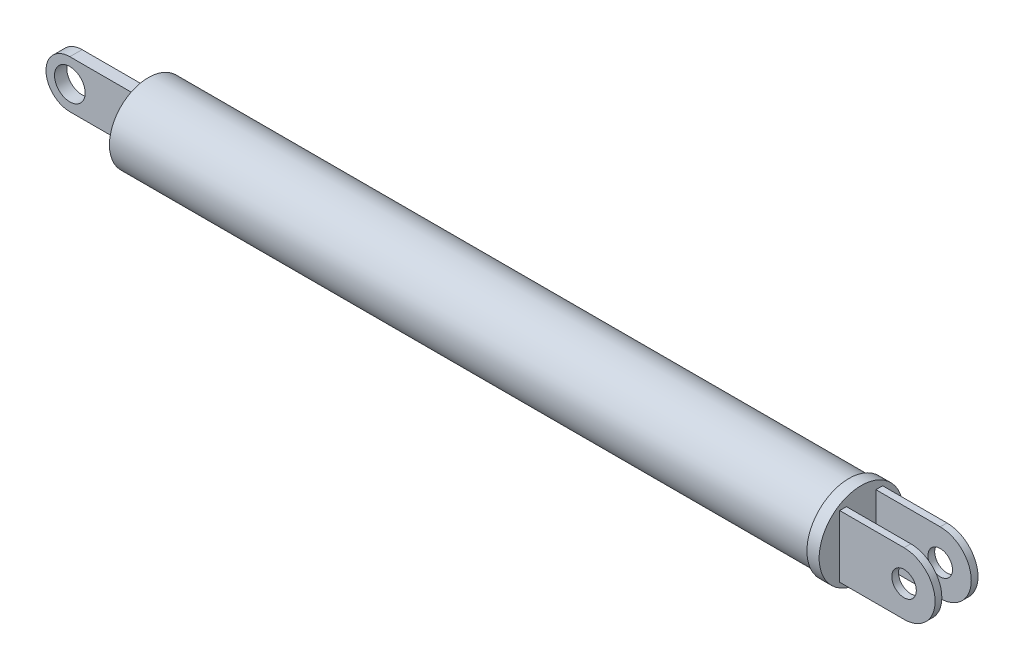
ISO-10303-21;
HEADER;
FILE_DESCRIPTION(('STEP AP214'),'2;1');
FILE_NAME('part.step','',(''),(''),'','','');
FILE_SCHEMA(('AUTOMOTIVE_DESIGN { 1 0 10303 214 1 1 1 1 }'));
ENDSEC;
DATA;
#1=APPLICATION_CONTEXT('core data for automotive mechanical design processes');
#2=APPLICATION_PROTOCOL_DEFINITION('international standard','automotive_design',2000,#1);
#3=PRODUCT_CONTEXT('',#1,'mechanical');
#4=PRODUCT('Part','Part','',(#3));
#5=PRODUCT_RELATED_PRODUCT_CATEGORY('part','',(#4));
#6=PRODUCT_DEFINITION_FORMATION('','',#4);
#7=PRODUCT_DEFINITION_CONTEXT('part definition',#1,'design');
#8=PRODUCT_DEFINITION('design','',#6,#7);
#9=PRODUCT_DEFINITION_SHAPE('','',#8);
#10=(LENGTH_UNIT() NAMED_UNIT(*) SI_UNIT(.MILLI.,.METRE.));
#11=(NAMED_UNIT(*) PLANE_ANGLE_UNIT() SI_UNIT($,.RADIAN.));
#12=(NAMED_UNIT(*) SI_UNIT($,.STERADIAN.) SOLID_ANGLE_UNIT());
#13=UNCERTAINTY_MEASURE_WITH_UNIT(LENGTH_MEASURE(1.E-05),#10,'distance_accuracy_value','');
#14=(GEOMETRIC_REPRESENTATION_CONTEXT(3) GLOBAL_UNCERTAINTY_ASSIGNED_CONTEXT((#13)) GLOBAL_UNIT_ASSIGNED_CONTEXT((#10,
#11,#12)) REPRESENTATION_CONTEXT('',''));
#15=CARTESIAN_POINT('',(0.,0.,0.));
#16=DIRECTION('',(0.,0.,1.));
#17=DIRECTION('',(1.,0.,0.));
#18=AXIS2_PLACEMENT_3D('',#15,#16,#17);
#19=CARTESIAN_POINT('',(232.6,-10.1328519164728,7.));
#20=DIRECTION('',(0.,1.,0.));
#21=DIRECTION('',(0.,0.,1.));
#22=AXIS2_PLACEMENT_3D('',#19,#20,#21);
#23=PLANE('',#22);
#24=DIRECTION('',(0.,0.,-1.));
#25=VECTOR('',#24,1.);
#26=CARTESIAN_POINT('',(253.6,-10.1328519164728,7.));
#27=LINE('',#26,#25);
#28=CARTESIAN_POINT('',(253.6,-10.1328519164728,-4.80121317375937));
#29=VERTEX_POINT('',#28);
#30=CARTESIAN_POINT('',(253.6,-10.1328519164728,-7.));
#31=VERTEX_POINT('',#30);
#32=EDGE_CURVE('E250',#29,#31,#27,.T.);
#33=ORIENTED_EDGE('',*,*,#32,.F.);
#34=DIRECTION('',(-1.,0.,0.));
#35=VECTOR('',#34,1.);
#36=CARTESIAN_POINT('',(232.6,-10.1328519164728,-4.80121317375936));
#37=LINE('',#36,#35);
#38=CARTESIAN_POINT('',(232.6,-10.1328519164728,-4.80121317375936));
#39=VERTEX_POINT('',#38);
#40=EDGE_CURVE('E219',#29,#39,#37,.T.);
#41=ORIENTED_EDGE('',*,*,#40,.T.);
#42=DIRECTION('',(0.,0.,-1.));
#43=VECTOR('',#42,1.);
#44=CARTESIAN_POINT('',(232.6,-10.1328519164728,7.));
#45=LINE('',#44,#43);
#46=CARTESIAN_POINT('',(232.6,-10.1328519164728,-7.));
#47=VERTEX_POINT('',#46);
#48=EDGE_CURVE('E152',#39,#47,#45,.T.);
#49=ORIENTED_EDGE('',*,*,#48,.T.);
#50=DIRECTION('',(1.,0.,0.));
#51=VECTOR('',#50,1.);
#52=CARTESIAN_POINT('',(232.6,-10.1328519164728,-7.));
#53=LINE('',#52,#51);
#54=EDGE_CURVE('E239',#47,#31,#53,.T.);
#55=ORIENTED_EDGE('',*,*,#54,.T.);
#56=EDGE_LOOP('',(#33,#41,#49,#55));
#57=FACE_BOUND('',#56,.T.);
#58=ADVANCED_FACE('F37',(#57),#23,.F.);
#59=CARTESIAN_POINT('',(253.6,0.,7.));
#60=DIRECTION('',(0.,0.,-1.));
#61=DIRECTION('',(-1.,0.,0.));
#62=AXIS2_PLACEMENT_3D('',#59,#60,#61);
#63=CYLINDRICAL_SURFACE('',#62,10.1328519164728);
#64=DIRECTION('',(0.,0.,-1.));
#65=VECTOR('',#64,1.);
#66=CARTESIAN_POINT('',(253.6,10.1328519164728,7.));
#67=LINE('',#66,#65);
#68=CARTESIAN_POINT('',(253.6,10.1328519164728,-4.80121317375937));
#69=VERTEX_POINT('',#68);
#70=CARTESIAN_POINT('',(253.6,10.1328519164728,-7.));
#71=VERTEX_POINT('',#70);
#72=EDGE_CURVE('E247',#69,#71,#67,.T.);
#73=ORIENTED_EDGE('',*,*,#72,.F.);
#74=CARTESIAN_POINT('',(253.6,0.,-4.80121317375937));
#75=DIRECTION('',(0.,0.,-1.));
#76=DIRECTION('',(-1.,0.,0.));
#77=AXIS2_PLACEMENT_3D('',#74,#75,#76);
#78=CIRCLE('',#77,10.1328519164728);
#79=EDGE_CURVE('E216',#69,#29,#78,.T.);
#80=ORIENTED_EDGE('',*,*,#79,.T.);
#81=ORIENTED_EDGE('',*,*,#32,.T.);
#82=CARTESIAN_POINT('',(253.6,0.,-7.));
#83=DIRECTION('',(0.,0.,1.));
#84=DIRECTION('',(-1.,0.,0.));
#85=AXIS2_PLACEMENT_3D('',#82,#83,#84);
#86=CIRCLE('',#85,10.1328519164728);
#87=EDGE_CURVE('E242',#31,#71,#86,.T.);
#88=ORIENTED_EDGE('',*,*,#87,.T.);
#89=EDGE_LOOP('',(#73,#80,#81,#88));
#90=FACE_BOUND('',#89,.T.);
#91=ADVANCED_FACE('F260',(#90),#63,.T.);
#92=CARTESIAN_POINT('',(232.6,10.1328519164728,7.));
#93=DIRECTION('',(0.,-1.,0.));
#94=DIRECTION('',(0.,0.,-1.));
#95=AXIS2_PLACEMENT_3D('',#92,#93,#94);
#96=PLANE('',#95);
#97=DIRECTION('',(0.,0.,-1.));
#98=VECTOR('',#97,1.);
#99=CARTESIAN_POINT('',(232.6,10.1328519164728,7.));
#100=LINE('',#99,#98);
#101=CARTESIAN_POINT('',(232.6,10.1328519164728,-4.80121317375936));
#102=VERTEX_POINT('',#101);
#103=CARTESIAN_POINT('',(232.6,10.1328519164728,-7.));
#104=VERTEX_POINT('',#103);
#105=EDGE_CURVE('E62',#102,#104,#100,.T.);
#106=ORIENTED_EDGE('',*,*,#105,.F.);
#107=DIRECTION('',(1.,0.,0.));
#108=VECTOR('',#107,1.);
#109=CARTESIAN_POINT('',(232.6,10.1328519164728,-4.80121317375936));
#110=LINE('',#109,#108);
#111=EDGE_CURVE('E213',#102,#69,#110,.T.);
#112=ORIENTED_EDGE('',*,*,#111,.T.);
#113=ORIENTED_EDGE('',*,*,#72,.T.);
#114=DIRECTION('',(-1.,0.,0.));
#115=VECTOR('',#114,1.);
#116=CARTESIAN_POINT('',(232.6,10.1328519164728,-7.));
#117=LINE('',#116,#115);
#118=EDGE_CURVE('E232',#71,#104,#117,.T.);
#119=ORIENTED_EDGE('',*,*,#118,.T.);
#120=EDGE_LOOP('',(#106,#112,#113,#119));
#121=FACE_BOUND('',#120,.T.);
#122=ADVANCED_FACE('F256',(#121),#96,.F.);
#123=CARTESIAN_POINT('',(253.6,0.,7.));
#124=DIRECTION('',(0.,0.,-1.));
#125=DIRECTION('',(-1.,0.,0.));
#126=AXIS2_PLACEMENT_3D('',#123,#124,#125);
#127=CYLINDRICAL_SURFACE('',#126,3.99999999999999);
#128=CARTESIAN_POINT('',(253.6,0.,-4.80121317375937));
#129=DIRECTION('',(0.,0.,-1.));
#130=DIRECTION('',(-1.,0.,0.));
#131=AXIS2_PLACEMENT_3D('',#128,#129,#130);
#132=CIRCLE('',#131,3.99999999999999);
#133=CARTESIAN_POINT('',(249.6,0.,-4.80121317375937));
#134=VERTEX_POINT('',#133);
#135=EDGE_CURVE('E41',#134,#134,#132,.T.);
#136=ORIENTED_EDGE('',*,*,#135,.F.);
#137=EDGE_LOOP('',(#136));
#138=FACE_BOUND('',#137,.T.);
#139=CARTESIAN_POINT('',(253.6,0.,-7.));
#140=DIRECTION('',(0.,0.,1.));
#141=DIRECTION('',(1.,0.,0.));
#142=AXIS2_PLACEMENT_3D('',#139,#140,#141);
#143=CIRCLE('',#142,3.99999999999999);
#144=CARTESIAN_POINT('',(257.6,0.,-7.));
#145=VERTEX_POINT('',#144);
#146=EDGE_CURVE('E222',#145,#145,#143,.T.);
#147=ORIENTED_EDGE('',*,*,#146,.F.);
#148=EDGE_LOOP('',(#147));
#149=FACE_BOUND('',#148,.T.);
#150=ADVANCED_FACE('F281',(#138,#149),#127,.F.);
#151=CARTESIAN_POINT('',(232.6,0.,0.));
#152=DIRECTION('',(1.,0.,0.));
#153=DIRECTION('',(0.,0.,-1.));
#154=AXIS2_PLACEMENT_3D('',#151,#152,#153);
#155=PLANE('',#154);
#156=ORIENTED_EDGE('',*,*,#48,.F.);
#157=DIRECTION('',(0.,1.,0.));
#158=VECTOR('',#157,1.);
#159=CARTESIAN_POINT('',(232.6,-13.7,-4.80121317375936));
#160=LINE('',#159,#158);
#161=EDGE_CURVE('E146',#39,#102,#160,.T.);
#162=ORIENTED_EDGE('',*,*,#161,.T.);
#163=ORIENTED_EDGE('',*,*,#105,.T.);
#164=DIRECTION('',(0.,-1.,0.));
#165=VECTOR('',#164,1.);
#166=CARTESIAN_POINT('',(232.6,10.1328519164728,-7.));
#167=LINE('',#166,#165);
#168=EDGE_CURVE('E227',#104,#47,#167,.T.);
#169=ORIENTED_EDGE('',*,*,#168,.T.);
#170=EDGE_LOOP('',(#156,#162,#163,#169));
#171=FACE_BOUND('',#170,.T.);
#172=CARTESIAN_POINT('',(232.6,10.1328519164728,7.));
#173=VERTEX_POINT('',#172);
#174=CARTESIAN_POINT('',(232.6,10.1328519164728,4.80121317375939));
#175=VERTEX_POINT('',#174);
#176=EDGE_CURVE('E145',#173,#175,#100,.T.);
#177=ORIENTED_EDGE('',*,*,#176,.T.);
#178=DIRECTION('',(0.,1.,0.));
#179=VECTOR('',#178,1.);
#180=CARTESIAN_POINT('',(232.6,-13.7,4.80121317375939));
#181=LINE('',#180,#179);
#182=CARTESIAN_POINT('',(232.6,-10.1328519164728,4.80121317375939));
#183=VERTEX_POINT('',#182);
#184=EDGE_CURVE('E54',#183,#175,#181,.T.);
#185=ORIENTED_EDGE('',*,*,#184,.F.);
#186=CARTESIAN_POINT('',(232.6,-10.1328519164728,7.));
#187=VERTEX_POINT('',#186);
#188=EDGE_CURVE('E143',#187,#183,#45,.T.);
#189=ORIENTED_EDGE('',*,*,#188,.F.);
#190=DIRECTION('',(0.,-1.,0.));
#191=VECTOR('',#190,1.);
#192=CARTESIAN_POINT('',(232.6,10.1328519164728,7.));
#193=LINE('',#192,#191);
#194=EDGE_CURVE('E230',#173,#187,#193,.T.);
#195=ORIENTED_EDGE('',*,*,#194,.F.);
#196=EDGE_LOOP('',(#177,#185,#189,#195));
#197=FACE_BOUND('',#196,.T.);
#198=CARTESIAN_POINT('',(232.6,0.,0.));
#199=DIRECTION('',(1.,0.,0.));
#200=DIRECTION('',(0.,0.,-1.));
#201=AXIS2_PLACEMENT_3D('',#198,#199,#200);
#202=CIRCLE('',#201,13.7);
#203=CARTESIAN_POINT('',(232.6,0.,-13.7));
#204=VERTEX_POINT('',#203);
#205=EDGE_CURVE('E156',#204,#204,#202,.T.);
#206=ORIENTED_EDGE('',*,*,#205,.T.);
#207=EDGE_LOOP('',(#206));
#208=FACE_BOUND('',#207,.T.);
#209=ADVANCED_FACE('F140',(#171,#197,#208),#155,.T.);
#210=CARTESIAN_POINT('',(0.,0.,0.));
#211=DIRECTION('',(1.,0.,0.));
#212=DIRECTION('',(0.,0.,-1.));
#213=AXIS2_PLACEMENT_3D('',#210,#211,#212);
#214=PLANE('',#213);
#215=CARTESIAN_POINT('',(0.,0.,0.));
#216=DIRECTION('',(1.,0.,0.));
#217=DIRECTION('',(0.,0.,-1.));
#218=AXIS2_PLACEMENT_3D('',#215,#216,#217);
#219=CIRCLE('',#218,12.7);
#220=CARTESIAN_POINT('',(0.,0.,12.7));
#221=VERTEX_POINT('',#220);
#222=EDGE_CURVE('E46',#221,#221,#219,.T.);
#223=ORIENTED_EDGE('',*,*,#222,.F.);
#224=EDGE_LOOP('',(#223));
#225=FACE_BOUND('',#224,.T.);
#226=DIRECTION('',(0.,0.,-1.));
#227=VECTOR('',#226,1.);
#228=CARTESIAN_POINT('',(0.,7.77806758623207,2.));
#229=LINE('',#228,#227);
#230=CARTESIAN_POINT('',(0.,7.77806758623207,2.));
#231=VERTEX_POINT('',#230);
#232=CARTESIAN_POINT('',(0.,7.77806758623207,-2.));
#233=VERTEX_POINT('',#232);
#234=EDGE_CURVE('E198',#231,#233,#229,.T.);
#235=ORIENTED_EDGE('',*,*,#234,.F.);
#236=DIRECTION('',(0.,1.,0.));
#237=VECTOR('',#236,1.);
#238=CARTESIAN_POINT('',(0.,7.77806758623207,2.));
#239=LINE('',#238,#237);
#240=CARTESIAN_POINT('',(0.,-7.77806758623207,2.));
#241=VERTEX_POINT('',#240);
#242=EDGE_CURVE('E172',#241,#231,#239,.T.);
#243=ORIENTED_EDGE('',*,*,#242,.F.);
#244=DIRECTION('',(0.,0.,-1.));
#245=VECTOR('',#244,1.);
#246=CARTESIAN_POINT('',(0.,-7.77806758623207,2.));
#247=LINE('',#246,#245);
#248=CARTESIAN_POINT('',(0.,-7.77806758623207,-2.));
#249=VERTEX_POINT('',#248);
#250=EDGE_CURVE('E183',#241,#249,#247,.T.);
#251=ORIENTED_EDGE('',*,*,#250,.T.);
#252=DIRECTION('',(0.,1.,0.));
#253=VECTOR('',#252,1.);
#254=CARTESIAN_POINT('',(0.,7.77806758623207,-2.));
#255=LINE('',#254,#253);
#256=EDGE_CURVE('E169',#249,#233,#255,.T.);
#257=ORIENTED_EDGE('',*,*,#256,.T.);
#258=EDGE_LOOP('',(#235,#243,#251,#257));
#259=FACE_BOUND('',#258,.T.);
#260=ADVANCED_FACE('F317',(#225,#259),#214,.F.);
#261=CARTESIAN_POINT('',(228.6,0.,0.));
#262=DIRECTION('',(-1.,0.,0.));
#263=DIRECTION('',(0.,0.,1.));
#264=AXIS2_PLACEMENT_3D('',#261,#262,#263);
#265=CYLINDRICAL_SURFACE('',#264,12.7);
#266=CARTESIAN_POINT('',(228.6,0.,0.));
#267=DIRECTION('',(1.,0.,0.));
#268=DIRECTION('',(0.,0.,-1.));
#269=AXIS2_PLACEMENT_3D('',#266,#267,#268);
#270=CIRCLE('',#269,12.7);
#271=CARTESIAN_POINT('',(228.6,0.,12.7));
#272=VERTEX_POINT('',#271);
#273=EDGE_CURVE('E11',#272,#272,#270,.T.);
#274=CARTESIAN_POINT('',(228.6,0.,12.7));
#275=CARTESIAN_POINT('',(226.21875,0.,12.7));
#276=CARTESIAN_POINT('',(223.8375,0.,12.7));
#277=CARTESIAN_POINT('',(219.075,0.,12.7));
#278=CARTESIAN_POINT('',(216.69375,0.,12.7));
#279=CARTESIAN_POINT('',(211.93125,0.,12.7));
#280=CARTESIAN_POINT('',(209.55,0.,12.7));
#281=CARTESIAN_POINT('',(204.7875,0.,12.7));
#282=CARTESIAN_POINT('',(202.40625,0.,12.7));
#283=CARTESIAN_POINT('',(197.64375,0.,12.7));
#284=CARTESIAN_POINT('',(195.2625,0.,12.7));
#285=CARTESIAN_POINT('',(190.5,0.,12.7));
#286=CARTESIAN_POINT('',(188.11875,0.,12.7));
#287=CARTESIAN_POINT('',(183.35625,0.,12.7));
#288=CARTESIAN_POINT('',(180.975,0.,12.7));
#289=CARTESIAN_POINT('',(176.2125,0.,12.7));
#290=CARTESIAN_POINT('',(173.83125,0.,12.7));
#291=CARTESIAN_POINT('',(169.06875,0.,12.7));
#292=CARTESIAN_POINT('',(166.6875,0.,12.7));
#293=CARTESIAN_POINT('',(161.925,0.,12.7));
#294=CARTESIAN_POINT('',(159.54375,0.,12.7));
#295=CARTESIAN_POINT('',(154.78125,0.,12.7));
#296=CARTESIAN_POINT('',(152.4,0.,12.7));
#297=CARTESIAN_POINT('',(147.6375,0.,12.7));
#298=CARTESIAN_POINT('',(145.25625,0.,12.7));
#299=CARTESIAN_POINT('',(140.49375,0.,12.7));
#300=CARTESIAN_POINT('',(138.1125,0.,12.7));
#301=CARTESIAN_POINT('',(133.35,0.,12.7));
#302=CARTESIAN_POINT('',(130.96875,0.,12.7));
#303=CARTESIAN_POINT('',(126.20625,0.,12.7));
#304=CARTESIAN_POINT('',(123.825,0.,12.7));
#305=CARTESIAN_POINT('',(119.0625,0.,12.7));
#306=CARTESIAN_POINT('',(116.68125,0.,12.7));
#307=CARTESIAN_POINT('',(111.91875,0.,12.7));
#308=CARTESIAN_POINT('',(109.5375,0.,12.7));
#309=CARTESIAN_POINT('',(104.775,0.,12.7));
#310=CARTESIAN_POINT('',(102.39375,0.,12.7));
#311=CARTESIAN_POINT('',(97.63125,0.,12.7));
#312=CARTESIAN_POINT('',(95.25,0.,12.7));
#313=CARTESIAN_POINT('',(90.4875,0.,12.7));
#314=CARTESIAN_POINT('',(88.10625,0.,12.7));
#315=CARTESIAN_POINT('',(83.34375,0.,12.7));
#316=CARTESIAN_POINT('',(80.9625,0.,12.7));
#317=CARTESIAN_POINT('',(76.2,0.,12.7));
#318=CARTESIAN_POINT('',(73.81875,0.,12.7));
#319=CARTESIAN_POINT('',(69.05625,0.,12.7));
#320=CARTESIAN_POINT('',(66.675,0.,12.7));
#321=CARTESIAN_POINT('',(61.9125,0.,12.7));
#322=CARTESIAN_POINT('',(59.53125,0.,12.7));
#323=CARTESIAN_POINT('',(54.76875,0.,12.7));
#324=CARTESIAN_POINT('',(52.3875,0.,12.7));
#325=CARTESIAN_POINT('',(47.625,0.,12.7));
#326=CARTESIAN_POINT('',(45.24375,0.,12.7));
#327=CARTESIAN_POINT('',(40.48125,0.,12.7));
#328=CARTESIAN_POINT('',(38.1,0.,12.7));
#329=CARTESIAN_POINT('',(33.3375,0.,12.7));
#330=CARTESIAN_POINT('',(30.95625,0.,12.7));
#331=CARTESIAN_POINT('',(26.19375,0.,12.7));
#332=CARTESIAN_POINT('',(23.8125,0.,12.7));
#333=CARTESIAN_POINT('',(19.05,0.,12.7));
#334=CARTESIAN_POINT('',(16.66875,0.,12.7));
#335=CARTESIAN_POINT('',(11.90625,0.,12.7));
#336=CARTESIAN_POINT('',(9.52499999999998,0.,12.7));
#337=CARTESIAN_POINT('',(4.76249999999997,0.,12.7));
#338=CARTESIAN_POINT('',(2.38124999999997,0.,12.7));
#339=CARTESIAN_POINT('',(0.,0.,12.7));
#340=B_SPLINE_CURVE_WITH_KNOTS('',3,(#274,#275,#276,#277,#278,#279,#280,#281,#282,#283,#284,
#285,#286,#287,#288,#289,#290,#291,#292,#293,#294,#295,#296,#297,#298,#299,#300,#301,#302,#303,
#304,#305,#306,#307,#308,#309,#310,#311,#312,#313,#314,#315,#316,#317,#318,#319,#320,#321,#322,
#323,#324,#325,#326,#327,#328,#329,#330,#331,#332,#333,#334,#335,#336,#337,#338,#339),
.UNSPECIFIED.,.F.,.F.,(4,2,2,2,2,2,2,2,2,2,2,2,2,2,2,2,2,2,2,2,2,2,2,2,2,2,2,2,2,2,2,2,4),(0.,
7.14375,14.2875,21.43125,28.575,35.71875,42.8625,50.00625,57.15,64.29375,71.4375,78.58125,
85.725,92.86875,100.0125,107.15625,114.3,121.44375,128.5875,135.73125,142.875,150.01875,
157.1625,164.30625,171.45,178.59375,185.7375,192.88125,200.025,207.16875,214.3125,221.45625,
228.6),.UNSPECIFIED.);
#341=EDGE_CURVE('BSEAM39',#272,#221,#340,.T.);
#342=ORIENTED_EDGE('',*,*,#273,.F.);
#343=ORIENTED_EDGE('',*,*,#222,.T.);
#344=ORIENTED_EDGE('',*,*,#341,.T.);
#345=ORIENTED_EDGE('',*,*,#341,.F.);
#346=EDGE_LOOP('',(#342,#344,#343,#345));
#347=FACE_BOUND('',#346,.T.);
#348=ADVANCED_FACE('F39',(#347),#265,.T.);
#349=CARTESIAN_POINT('',(-23.6251254908995,0.,2.));
#350=DIRECTION('',(0.,0.,1.));
#351=DIRECTION('',(1.,0.,0.));
#352=AXIS2_PLACEMENT_3D('',#349,#350,#351);
#353=PLANE('',#352);
#354=ORIENTED_EDGE('',*,*,#242,.T.);
#355=DIRECTION('',(-1.,0.,0.));
#356=VECTOR('',#355,1.);
#357=CARTESIAN_POINT('',(0.,7.77806758623207,2.));
#358=LINE('',#357,#356);
#359=CARTESIAN_POINT('',(-23.6251254908995,7.77806758623206,2.));
#360=VERTEX_POINT('',#359);
#361=EDGE_CURVE('E175',#231,#360,#358,.T.);
#362=ORIENTED_EDGE('',*,*,#361,.T.);
#363=CARTESIAN_POINT('',(-23.6251254908995,0.,2.));
#364=DIRECTION('',(0.,0.,1.));
#365=DIRECTION('',(1.,0.,0.));
#366=AXIS2_PLACEMENT_3D('',#363,#364,#365);
#367=CIRCLE('',#366,7.77806758623206);
#368=CARTESIAN_POINT('',(-23.6251254908995,-7.77806758623207,2.));
#369=VERTEX_POINT('',#368);
#370=EDGE_CURVE('E178',#360,#369,#367,.T.);
#371=ORIENTED_EDGE('',*,*,#370,.T.);
#372=DIRECTION('',(1.,0.,0.));
#373=VECTOR('',#372,1.);
#374=CARTESIAN_POINT('',(0.,-7.77806758623207,2.));
#375=LINE('',#374,#373);
#376=EDGE_CURVE('E180',#369,#241,#375,.T.);
#377=ORIENTED_EDGE('',*,*,#376,.T.);
#378=EDGE_LOOP('',(#354,#362,#371,#377));
#379=FACE_BOUND('',#378,.T.);
#380=CARTESIAN_POINT('',(-23.6251254908995,0.,2.));
#381=DIRECTION('',(0.,0.,1.));
#382=DIRECTION('',(1.,0.,0.));
#383=AXIS2_PLACEMENT_3D('',#380,#381,#382);
#384=CIRCLE('',#383,5.);
#385=CARTESIAN_POINT('',(-18.6251254908995,0.,2.));
#386=VERTEX_POINT('',#385);
#387=EDGE_CURVE('E165',#386,#386,#384,.T.);
#388=ORIENTED_EDGE('',*,*,#387,.F.);
#389=EDGE_LOOP('',(#388));
#390=FACE_BOUND('',#389,.T.);
#391=ADVANCED_FACE('F338',(#379,#390),#353,.T.);
#392=CARTESIAN_POINT('',(-23.6251254908995,0.,-2.));
#393=DIRECTION('',(0.,0.,1.));
#394=DIRECTION('',(1.,0.,0.));
#395=AXIS2_PLACEMENT_3D('',#392,#393,#394);
#396=PLANE('',#395);
#397=ORIENTED_EDGE('',*,*,#256,.F.);
#398=DIRECTION('',(1.,0.,0.));
#399=VECTOR('',#398,1.);
#400=CARTESIAN_POINT('',(0.,-7.77806758623207,-2.));
#401=LINE('',#400,#399);
#402=CARTESIAN_POINT('',(-23.6251254908995,-7.77806758623207,-2.));
#403=VERTEX_POINT('',#402);
#404=EDGE_CURVE('E176',#403,#249,#401,.T.);
#405=ORIENTED_EDGE('',*,*,#404,.F.);
#406=CARTESIAN_POINT('',(-23.6251254908995,0.,-2.));
#407=DIRECTION('',(0.,0.,1.));
#408=DIRECTION('',(1.,0.,0.));
#409=AXIS2_PLACEMENT_3D('',#406,#407,#408);
#410=CIRCLE('',#409,7.77806758623206);
#411=CARTESIAN_POINT('',(-23.6251254908995,7.77806758623206,-2.));
#412=VERTEX_POINT('',#411);
#413=EDGE_CURVE('E187',#412,#403,#410,.T.);
#414=ORIENTED_EDGE('',*,*,#413,.F.);
#415=DIRECTION('',(-1.,0.,0.));
#416=VECTOR('',#415,1.);
#417=CARTESIAN_POINT('',(0.,7.77806758623207,-2.));
#418=LINE('',#417,#416);
#419=EDGE_CURVE('E185',#233,#412,#418,.T.);
#420=ORIENTED_EDGE('',*,*,#419,.F.);
#421=EDGE_LOOP('',(#397,#405,#414,#420));
#422=FACE_BOUND('',#421,.T.);
#423=CARTESIAN_POINT('',(-23.6251254908995,0.,-2.));
#424=DIRECTION('',(0.,0.,1.));
#425=DIRECTION('',(1.,0.,0.));
#426=AXIS2_PLACEMENT_3D('',#423,#424,#425);
#427=CIRCLE('',#426,5.);
#428=CARTESIAN_POINT('',(-18.6251254908995,0.,-2.));
#429=VERTEX_POINT('',#428);
#430=EDGE_CURVE('E163',#429,#429,#427,.T.);
#431=ORIENTED_EDGE('',*,*,#430,.T.);
#432=EDGE_LOOP('',(#431));
#433=FACE_BOUND('',#432,.T.);
#434=ADVANCED_FACE('F341',(#422,#433),#396,.F.);
#435=CARTESIAN_POINT('',(0.,7.77806758623207,2.));
#436=DIRECTION('',(0.,-1.,0.));
#437=DIRECTION('',(1.,0.,0.));
#438=AXIS2_PLACEMENT_3D('',#435,#436,#437);
#439=PLANE('',#438);
#440=ORIENTED_EDGE('',*,*,#419,.T.);
#441=DIRECTION('',(0.,0.,-1.));
#442=VECTOR('',#441,1.);
#443=CARTESIAN_POINT('',(-23.6251254908995,7.77806758623206,2.));
#444=LINE('',#443,#442);
#445=EDGE_CURVE('E195',#360,#412,#444,.T.);
#446=ORIENTED_EDGE('',*,*,#445,.F.);
#447=ORIENTED_EDGE('',*,*,#361,.F.);
#448=ORIENTED_EDGE('',*,*,#234,.T.);
#449=EDGE_LOOP('',(#440,#446,#447,#448));
#450=FACE_BOUND('',#449,.T.);
#451=ADVANCED_FACE('F345',(#450),#439,.F.);
#452=CARTESIAN_POINT('',(-23.6251254908995,0.,2.));
#453=DIRECTION('',(0.,0.,-1.));
#454=DIRECTION('',(-1.,0.,0.));
#455=AXIS2_PLACEMENT_3D('',#452,#453,#454);
#456=CYLINDRICAL_SURFACE('',#455,7.77806758623206);
#457=ORIENTED_EDGE('',*,*,#413,.T.);
#458=DIRECTION('',(0.,0.,-1.));
#459=VECTOR('',#458,1.);
#460=CARTESIAN_POINT('',(-23.6251254908995,-7.77806758623207,2.));
#461=LINE('',#460,#459);
#462=EDGE_CURVE('E192',#369,#403,#461,.T.);
#463=ORIENTED_EDGE('',*,*,#462,.F.);
#464=ORIENTED_EDGE('',*,*,#370,.F.);
#465=ORIENTED_EDGE('',*,*,#445,.T.);
#466=EDGE_LOOP('',(#457,#463,#464,#465));
#467=FACE_BOUND('',#466,.T.);
#468=ADVANCED_FACE('F349',(#467),#456,.T.);
#469=CARTESIAN_POINT('',(0.,-7.77806758623207,2.));
#470=DIRECTION('',(0.,1.,0.));
#471=DIRECTION('',(-1.,0.,0.));
#472=AXIS2_PLACEMENT_3D('',#469,#470,#471);
#473=PLANE('',#472);
#474=ORIENTED_EDGE('',*,*,#404,.T.);
#475=ORIENTED_EDGE('',*,*,#250,.F.);
#476=ORIENTED_EDGE('',*,*,#376,.F.);
#477=ORIENTED_EDGE('',*,*,#462,.T.);
#478=EDGE_LOOP('',(#474,#475,#476,#477));
#479=FACE_BOUND('',#478,.T.);
#480=ADVANCED_FACE('F336',(#479),#473,.F.);
#481=CARTESIAN_POINT('',(-23.6251254908995,0.,2.));
#482=DIRECTION('',(0.,0.,-1.));
#483=DIRECTION('',(-1.,0.,0.));
#484=AXIS2_PLACEMENT_3D('',#481,#482,#483);
#485=CYLINDRICAL_SURFACE('',#484,5.);
#486=ORIENTED_EDGE('',*,*,#387,.T.);
#487=EDGE_LOOP('',(#486));
#488=FACE_BOUND('',#487,.T.);
#489=ORIENTED_EDGE('',*,*,#430,.F.);
#490=EDGE_LOOP('',(#489));
#491=FACE_BOUND('',#490,.T.);
#492=ADVANCED_FACE('F329',(#488,#491),#485,.F.);
#493=CARTESIAN_POINT('',(228.6,0.,0.));
#494=DIRECTION('',(1.,0.,0.));
#495=DIRECTION('',(0.,0.,-1.));
#496=AXIS2_PLACEMENT_3D('',#493,#494,#495);
#497=PLANE('',#496);
#498=CARTESIAN_POINT('',(228.6,0.,0.));
#499=DIRECTION('',(1.,0.,0.));
#500=DIRECTION('',(0.,0.,-1.));
#501=AXIS2_PLACEMENT_3D('',#498,#499,#500);
#502=CIRCLE('',#501,13.7);
#503=CARTESIAN_POINT('',(228.6,0.,-13.7));
#504=VERTEX_POINT('',#503);
#505=EDGE_CURVE('E151',#504,#504,#502,.T.);
#506=ORIENTED_EDGE('',*,*,#505,.F.);
#507=EDGE_LOOP('',(#506));
#508=FACE_BOUND('',#507,.T.);
#509=ORIENTED_EDGE('',*,*,#273,.T.);
#510=EDGE_LOOP('',(#509));
#511=FACE_BOUND('',#510,.T.);
#512=ADVANCED_FACE('F326',(#508,#511),#497,.F.);
#513=CARTESIAN_POINT('',(232.6,0.,0.));
#514=DIRECTION('',(-1.,0.,0.));
#515=DIRECTION('',(0.,0.,1.));
#516=AXIS2_PLACEMENT_3D('',#513,#514,#515);
#517=CYLINDRICAL_SURFACE('',#516,13.7);
#518=ORIENTED_EDGE('',*,*,#205,.F.);
#519=EDGE_LOOP('',(#518));
#520=FACE_BOUND('',#519,.T.);
#521=ORIENTED_EDGE('',*,*,#505,.T.);
#522=EDGE_LOOP('',(#521));
#523=FACE_BOUND('',#522,.T.);
#524=ADVANCED_FACE('F302',(#520,#523),#517,.T.);
#525=CARTESIAN_POINT('',(253.6,0.,7.));
#526=DIRECTION('',(0.,0.,-1.));
#527=DIRECTION('',(-1.,0.,0.));
#528=AXIS2_PLACEMENT_3D('',#525,#526,#527);
#529=PLANE('',#528);
#530=ORIENTED_EDGE('',*,*,#194,.T.);
#531=DIRECTION('',(1.,0.,0.));
#532=VECTOR('',#531,1.);
#533=CARTESIAN_POINT('',(232.6,-10.1328519164728,7.));
#534=LINE('',#533,#532);
#535=CARTESIAN_POINT('',(253.6,-10.1328519164728,7.));
#536=VERTEX_POINT('',#535);
#537=EDGE_CURVE('E149',#187,#536,#534,.T.);
#538=ORIENTED_EDGE('',*,*,#537,.T.);
#539=CARTESIAN_POINT('',(253.6,0.,7.));
#540=DIRECTION('',(0.,0.,1.));
#541=DIRECTION('',(-1.,0.,0.));
#542=AXIS2_PLACEMENT_3D('',#539,#540,#541);
#543=CIRCLE('',#542,10.1328519164728);
#544=CARTESIAN_POINT('',(253.6,10.1328519164728,7.));
#545=VERTEX_POINT('',#544);
#546=EDGE_CURVE('E234',#536,#545,#543,.T.);
#547=ORIENTED_EDGE('',*,*,#546,.T.);
#548=DIRECTION('',(-1.,0.,0.));
#549=VECTOR('',#548,1.);
#550=CARTESIAN_POINT('',(232.6,10.1328519164728,7.));
#551=LINE('',#550,#549);
#552=EDGE_CURVE('E236',#545,#173,#551,.T.);
#553=ORIENTED_EDGE('',*,*,#552,.T.);
#554=EDGE_LOOP('',(#530,#538,#547,#553));
#555=FACE_BOUND('',#554,.T.);
#556=CARTESIAN_POINT('',(253.6,0.,7.));
#557=DIRECTION('',(0.,0.,1.));
#558=DIRECTION('',(1.,0.,0.));
#559=AXIS2_PLACEMENT_3D('',#556,#557,#558);
#560=CIRCLE('',#559,3.99999999999999);
#561=CARTESIAN_POINT('',(257.6,0.,7.));
#562=VERTEX_POINT('',#561);
#563=EDGE_CURVE('E223',#562,#562,#560,.T.);
#564=ORIENTED_EDGE('',*,*,#563,.F.);
#565=EDGE_LOOP('',(#564));
#566=FACE_BOUND('',#565,.T.);
#567=ADVANCED_FACE('F297',(#555,#566),#529,.F.);
#568=CARTESIAN_POINT('',(253.6,0.,-7.));
#569=DIRECTION('',(0.,0.,-1.));
#570=DIRECTION('',(-1.,0.,0.));
#571=AXIS2_PLACEMENT_3D('',#568,#569,#570);
#572=PLANE('',#571);
#573=ORIENTED_EDGE('',*,*,#168,.F.);
#574=ORIENTED_EDGE('',*,*,#118,.F.);
#575=ORIENTED_EDGE('',*,*,#87,.F.);
#576=ORIENTED_EDGE('',*,*,#54,.F.);
#577=EDGE_LOOP('',(#573,#574,#575,#576));
#578=FACE_BOUND('',#577,.T.);
#579=ORIENTED_EDGE('',*,*,#146,.T.);
#580=EDGE_LOOP('',(#579));
#581=FACE_BOUND('',#580,.T.);
#582=ADVANCED_FACE('F264',(#578,#581),#572,.T.);
#583=ORIENTED_EDGE('',*,*,#188,.T.);
#584=DIRECTION('',(1.,0.,0.));
#585=VECTOR('',#584,1.);
#586=CARTESIAN_POINT('',(232.6,-10.1328519164728,4.80121317375939));
#587=LINE('',#586,#585);
#588=CARTESIAN_POINT('',(253.6,-10.1328519164728,4.80121317375939));
#589=VERTEX_POINT('',#588);
#590=EDGE_CURVE('E128',#183,#589,#587,.T.);
#591=ORIENTED_EDGE('',*,*,#590,.T.);
#592=EDGE_CURVE('E158',#536,#589,#27,.T.);
#593=ORIENTED_EDGE('',*,*,#592,.F.);
#594=ORIENTED_EDGE('',*,*,#537,.F.);
#595=EDGE_LOOP('',(#583,#591,#593,#594));
#596=FACE_BOUND('',#595,.T.);
#597=ADVANCED_FACE('F148',(#596),#23,.F.);
#598=ORIENTED_EDGE('',*,*,#592,.T.);
#599=CARTESIAN_POINT('',(253.6,0.,4.80121317375939));
#600=DIRECTION('',(0.,0.,1.));
#601=DIRECTION('',(1.,0.,0.));
#602=AXIS2_PLACEMENT_3D('',#599,#600,#601);
#603=CIRCLE('',#602,10.1328519164728);
#604=CARTESIAN_POINT('',(253.6,10.1328519164728,4.80121317375939));
#605=VERTEX_POINT('',#604);
#606=EDGE_CURVE('E131',#589,#605,#603,.T.);
#607=ORIENTED_EDGE('',*,*,#606,.T.);
#608=EDGE_CURVE('E248',#545,#605,#67,.T.);
#609=ORIENTED_EDGE('',*,*,#608,.F.);
#610=ORIENTED_EDGE('',*,*,#546,.F.);
#611=EDGE_LOOP('',(#598,#607,#609,#610));
#612=FACE_BOUND('',#611,.T.);
#613=ADVANCED_FACE('F289',(#612),#63,.T.);
#614=ORIENTED_EDGE('',*,*,#608,.T.);
#615=DIRECTION('',(-1.,0.,0.));
#616=VECTOR('',#615,1.);
#617=CARTESIAN_POINT('',(232.6,10.1328519164728,4.80121317375939));
#618=LINE('',#617,#616);
#619=EDGE_CURVE('E205',#605,#175,#618,.T.);
#620=ORIENTED_EDGE('',*,*,#619,.T.);
#621=ORIENTED_EDGE('',*,*,#176,.F.);
#622=ORIENTED_EDGE('',*,*,#552,.F.);
#623=EDGE_LOOP('',(#614,#620,#621,#622));
#624=FACE_BOUND('',#623,.T.);
#625=ADVANCED_FACE('F278',(#624),#96,.F.);
#626=CARTESIAN_POINT('',(253.6,0.,4.80121317375939));
#627=DIRECTION('',(0.,0.,1.));
#628=DIRECTION('',(1.,0.,0.));
#629=AXIS2_PLACEMENT_3D('',#626,#627,#628);
#630=CIRCLE('',#629,3.99999999999999);
#631=CARTESIAN_POINT('',(257.6,0.,4.80121317375939));
#632=VERTEX_POINT('',#631);
#633=EDGE_CURVE('E203',#632,#632,#630,.T.);
#634=ORIENTED_EDGE('',*,*,#633,.F.);
#635=EDGE_LOOP('',(#634));
#636=FACE_BOUND('',#635,.T.);
#637=ORIENTED_EDGE('',*,*,#563,.T.);
#638=EDGE_LOOP('',(#637));
#639=FACE_BOUND('',#638,.T.);
#640=ADVANCED_FACE('F270',(#636,#639),#127,.F.);
#641=CARTESIAN_POINT('',(232.6,-13.7,-4.80121317375936));
#642=DIRECTION('',(0.,0.,-1.));
#643=DIRECTION('',(-1.,0.,0.));
#644=AXIS2_PLACEMENT_3D('',#641,#642,#643);
#645=PLANE('',#644);
#646=ORIENTED_EDGE('',*,*,#135,.T.);
#647=EDGE_LOOP('',(#646));
#648=FACE_BOUND('',#647,.T.);
#649=ORIENTED_EDGE('',*,*,#79,.F.);
#650=ORIENTED_EDGE('',*,*,#111,.F.);
#651=ORIENTED_EDGE('',*,*,#161,.F.);
#652=ORIENTED_EDGE('',*,*,#40,.F.);
#653=EDGE_LOOP('',(#649,#650,#651,#652));
#654=FACE_BOUND('',#653,.T.);
#655=ADVANCED_FACE('F268',(#648,#654),#645,.F.);
#656=CARTESIAN_POINT('',(232.6,-13.7,4.80121317375939));
#657=DIRECTION('',(0.,0.,1.));
#658=DIRECTION('',(1.,0.,0.));
#659=AXIS2_PLACEMENT_3D('',#656,#657,#658);
#660=PLANE('',#659);
#661=ORIENTED_EDGE('',*,*,#633,.T.);
#662=EDGE_LOOP('',(#661));
#663=FACE_BOUND('',#662,.T.);
#664=ORIENTED_EDGE('',*,*,#184,.T.);
#665=ORIENTED_EDGE('',*,*,#619,.F.);
#666=ORIENTED_EDGE('',*,*,#606,.F.);
#667=ORIENTED_EDGE('',*,*,#590,.F.);
#668=EDGE_LOOP('',(#664,#665,#666,#667));
#669=FACE_BOUND('',#668,.T.);
#670=ADVANCED_FACE('F129',(#663,#669),#660,.F.);
#671=CLOSED_SHELL('',(#58,#91,#122,#150,#209,#260,#348,#391,#434,#451,#468,#480,#492,#512,#524,
#567,#582,#597,#613,#625,#640,#655,#670));
#672=MANIFOLD_SOLID_BREP('B2',#671);
#673=ADVANCED_BREP_SHAPE_REPRESENTATION('',(#18,#672),#14);
#674=SHAPE_DEFINITION_REPRESENTATION(#9,#673);
ENDSEC;
END-ISO-10303-21;
